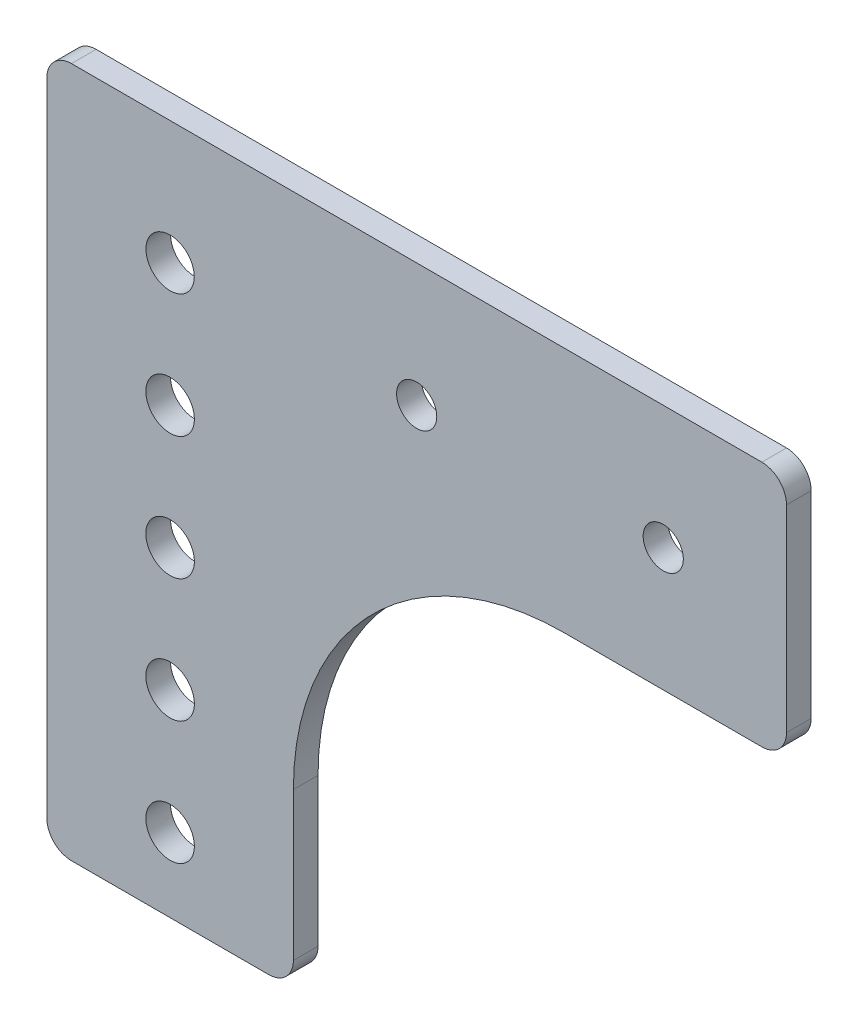
ISO-10303-21;
HEADER;
FILE_DESCRIPTION(('STEP AP214'),'2;1');
FILE_NAME('part.step','',(''),(''),'','','');
FILE_SCHEMA(('AUTOMOTIVE_DESIGN { 1 0 10303 214 1 1 1 1 }'));
ENDSEC;
DATA;
#1=APPLICATION_CONTEXT('core data for automotive mechanical design processes');
#2=APPLICATION_PROTOCOL_DEFINITION('international standard','automotive_design',2000,#1);
#3=PRODUCT_CONTEXT('',#1,'mechanical');
#4=PRODUCT('Part','Part','',(#3));
#5=PRODUCT_RELATED_PRODUCT_CATEGORY('part','',(#4));
#6=PRODUCT_DEFINITION_FORMATION('','',#4);
#7=PRODUCT_DEFINITION_CONTEXT('part definition',#1,'design');
#8=PRODUCT_DEFINITION('design','',#6,#7);
#9=PRODUCT_DEFINITION_SHAPE('','',#8);
#10=(LENGTH_UNIT() NAMED_UNIT(*) SI_UNIT(.MILLI.,.METRE.));
#11=(NAMED_UNIT(*) PLANE_ANGLE_UNIT() SI_UNIT($,.RADIAN.));
#12=(NAMED_UNIT(*) SI_UNIT($,.STERADIAN.) SOLID_ANGLE_UNIT());
#13=UNCERTAINTY_MEASURE_WITH_UNIT(LENGTH_MEASURE(1.E-05),#10,'distance_accuracy_value','');
#14=(GEOMETRIC_REPRESENTATION_CONTEXT(3) GLOBAL_UNCERTAINTY_ASSIGNED_CONTEXT((#13)) GLOBAL_UNIT_ASSIGNED_CONTEXT((#10,
#11,#12)) REPRESENTATION_CONTEXT('',''));
#15=CARTESIAN_POINT('',(0.,0.,0.));
#16=DIRECTION('',(0.,0.,1.));
#17=DIRECTION('',(1.,0.,0.));
#18=AXIS2_PLACEMENT_3D('',#15,#16,#17);
#19=CARTESIAN_POINT('',(14.5399999999993,-27.9400000000002,2.54));
#20=DIRECTION('',(0.,0.,1.));
#21=DIRECTION('',(1.,0.,0.));
#22=AXIS2_PLACEMENT_3D('',#19,#20,#21);
#23=PLANE('',#22);
#24=CARTESIAN_POINT('',(50.0999999999995,-38.1,2.54));
#25=DIRECTION('',(0.,0.,1.));
#26=DIRECTION('',(1.,0.,0.));
#27=AXIS2_PLACEMENT_3D('',#24,#25,#26);
#28=CIRCLE('',#27,2.07009999999997);
#29=CARTESIAN_POINT('',(52.1700999999995,-38.1,2.54));
#30=VERTEX_POINT('',#29);
#31=EDGE_CURVE('E277',#30,#30,#28,.T.);
#32=ORIENTED_EDGE('',*,*,#31,.F.);
#33=EDGE_LOOP('',(#32));
#34=FACE_BOUND('',#33,.T.);
#35=CARTESIAN_POINT('',(24.6999999999996,-50.8000000000002,2.54));
#36=DIRECTION('',(0.,0.,1.));
#37=DIRECTION('',(1.,0.,0.));
#38=AXIS2_PLACEMENT_3D('',#35,#36,#37);
#39=CIRCLE('',#38,2.49999999999967);
#40=CARTESIAN_POINT('',(27.1999999999992,-50.8000000000002,2.54));
#41=VERTEX_POINT('',#40);
#42=EDGE_CURVE('E265',#41,#41,#39,.T.);
#43=ORIENTED_EDGE('',*,*,#42,.F.);
#44=EDGE_LOOP('',(#43));
#45=FACE_BOUND('',#44,.T.);
#46=CARTESIAN_POINT('',(24.6999999999996,-76.2,2.54));
#47=DIRECTION('',(0.,0.,1.));
#48=DIRECTION('',(1.,0.,0.));
#49=AXIS2_PLACEMENT_3D('',#46,#47,#48);
#50=CIRCLE('',#49,2.49999999999978);
#51=CARTESIAN_POINT('',(27.1999999999994,-76.2,2.54));
#52=VERTEX_POINT('',#51);
#53=EDGE_CURVE('E253',#52,#52,#50,.T.);
#54=ORIENTED_EDGE('',*,*,#53,.F.);
#55=EDGE_LOOP('',(#54));
#56=FACE_BOUND('',#55,.T.);
#57=DIRECTION('',(0.,-1.,0.));
#58=VECTOR('',#57,1.);
#59=CARTESIAN_POINT('',(11.9999999999993,-93.9800000000002,2.54));
#60=LINE('',#59,#58);
#61=CARTESIAN_POINT('',(11.9999999999993,-27.9400000000002,2.54));
#62=VERTEX_POINT('',#61);
#63=CARTESIAN_POINT('',(11.9999999999993,-93.9800000000002,2.54));
#64=VERTEX_POINT('',#63);
#65=EDGE_CURVE('E50',#62,#64,#60,.T.);
#66=ORIENTED_EDGE('',*,*,#65,.T.);
#67=CARTESIAN_POINT('',(14.5399999999993,-93.9800000000002,2.54));
#68=DIRECTION('',(0.,0.,1.));
#69=DIRECTION('',(-1.,0.,0.));
#70=AXIS2_PLACEMENT_3D('',#67,#68,#69);
#71=CIRCLE('',#70,2.54);
#72=CARTESIAN_POINT('',(14.5399999999993,-96.5200000000002,2.54));
#73=VERTEX_POINT('',#72);
#74=EDGE_CURVE('E106',#64,#73,#71,.T.);
#75=ORIENTED_EDGE('',*,*,#74,.T.);
#76=DIRECTION('',(1.,0.,0.));
#77=VECTOR('',#76,1.);
#78=CARTESIAN_POINT('',(34.8599999999996,-96.5200000000002,2.54));
#79=LINE('',#78,#77);
#80=CARTESIAN_POINT('',(34.8599999999996,-96.5200000000002,2.54));
#81=VERTEX_POINT('',#80);
#82=EDGE_CURVE('E206',#73,#81,#79,.T.);
#83=ORIENTED_EDGE('',*,*,#82,.T.);
#84=CARTESIAN_POINT('',(34.8599999999996,-93.9800000000002,2.54));
#85=DIRECTION('',(0.,0.,1.));
#86=DIRECTION('',(1.,0.,0.));
#87=AXIS2_PLACEMENT_3D('',#84,#85,#86);
#88=CIRCLE('',#87,2.54);
#89=CARTESIAN_POINT('',(37.3999999999996,-93.9800000000002,2.54));
#90=VERTEX_POINT('',#89);
#91=EDGE_CURVE('E226',#81,#90,#88,.T.);
#92=ORIENTED_EDGE('',*,*,#91,.T.);
#93=DIRECTION('',(0.,1.,0.));
#94=VECTOR('',#93,1.);
#95=CARTESIAN_POINT('',(37.3999999999996,-93.9800000000002,2.54));
#96=LINE('',#95,#94);
#97=CARTESIAN_POINT('',(37.3999999999995,-78.7399999999999,2.54));
#98=VERTEX_POINT('',#97);
#99=EDGE_CURVE('E223',#90,#98,#96,.T.);
#100=ORIENTED_EDGE('',*,*,#99,.T.);
#101=CARTESIAN_POINT('',(65.3399999999996,-78.74,2.54));
#102=DIRECTION('',(0.,0.,-1.));
#103=DIRECTION('',(-1.,0.,0.));
#104=AXIS2_PLACEMENT_3D('',#101,#102,#103);
#105=CIRCLE('',#104,27.94);
#106=CARTESIAN_POINT('',(65.3399999999996,-50.7999999999999,2.54));
#107=VERTEX_POINT('',#106);
#108=EDGE_CURVE('E225',#98,#107,#105,.T.);
#109=ORIENTED_EDGE('',*,*,#108,.T.);
#110=DIRECTION('',(1.,0.,0.));
#111=VECTOR('',#110,1.);
#112=CARTESIAN_POINT('',(85.6599999999993,-50.7999999999999,2.54));
#113=LINE('',#112,#111);
#114=CARTESIAN_POINT('',(85.6599999999993,-50.7999999999999,2.54));
#115=VERTEX_POINT('',#114);
#116=EDGE_CURVE('E228',#107,#115,#113,.T.);
#117=ORIENTED_EDGE('',*,*,#116,.T.);
#118=CARTESIAN_POINT('',(85.6599999999993,-48.2599999999999,2.54));
#119=DIRECTION('',(0.,0.,1.));
#120=DIRECTION('',(1.,0.,0.));
#121=AXIS2_PLACEMENT_3D('',#118,#119,#120);
#122=CIRCLE('',#121,2.53999999999999);
#123=CARTESIAN_POINT('',(88.1999999999993,-48.2599999999999,2.54));
#124=VERTEX_POINT('',#123);
#125=EDGE_CURVE('E234',#115,#124,#122,.T.);
#126=ORIENTED_EDGE('',*,*,#125,.T.);
#127=DIRECTION('',(0.,1.,0.));
#128=VECTOR('',#127,1.);
#129=CARTESIAN_POINT('',(88.1999999999993,-48.2599999999999,2.54));
#130=LINE('',#129,#128);
#131=CARTESIAN_POINT('',(88.1999999999992,-27.9400000000002,2.54));
#132=VERTEX_POINT('',#131);
#133=EDGE_CURVE('E138',#124,#132,#130,.T.);
#134=ORIENTED_EDGE('',*,*,#133,.T.);
#135=CARTESIAN_POINT('',(85.6599999999993,-27.9400000000002,2.54));
#136=DIRECTION('',(0.,0.,1.));
#137=DIRECTION('',(1.,0.,0.));
#138=AXIS2_PLACEMENT_3D('',#135,#136,#137);
#139=CIRCLE('',#138,2.53999999999999);
#140=CARTESIAN_POINT('',(85.6599999999993,-25.4000000000002,2.54));
#141=VERTEX_POINT('',#140);
#142=EDGE_CURVE('E132',#132,#141,#139,.T.);
#143=ORIENTED_EDGE('',*,*,#142,.T.);
#144=DIRECTION('',(-1.,0.,0.));
#145=VECTOR('',#144,1.);
#146=CARTESIAN_POINT('',(85.6599999999993,-25.4000000000002,2.54));
#147=LINE('',#146,#145);
#148=CARTESIAN_POINT('',(14.5399999999993,-25.4000000000002,2.54));
#149=VERTEX_POINT('',#148);
#150=EDGE_CURVE('E136',#141,#149,#147,.T.);
#151=ORIENTED_EDGE('',*,*,#150,.T.);
#152=CARTESIAN_POINT('',(14.5399999999993,-27.9400000000002,2.54));
#153=DIRECTION('',(0.,0.,1.));
#154=DIRECTION('',(1.,0.,0.));
#155=AXIS2_PLACEMENT_3D('',#152,#153,#154);
#156=CIRCLE('',#155,2.54);
#157=EDGE_CURVE('E152',#149,#62,#156,.T.);
#158=ORIENTED_EDGE('',*,*,#157,.T.);
#159=EDGE_LOOP('',(#66,#75,#83,#92,#100,#109,#117,#126,#134,#143,#151,#158));
#160=FACE_BOUND('',#159,.T.);
#161=CARTESIAN_POINT('',(24.6999999999996,-88.9000000000002,2.54));
#162=DIRECTION('',(0.,0.,1.));
#163=DIRECTION('',(1.,0.,0.));
#164=AXIS2_PLACEMENT_3D('',#161,#162,#163);
#165=CIRCLE('',#164,2.49999999999967);
#166=CARTESIAN_POINT('',(27.1999999999992,-88.9000000000002,2.54));
#167=VERTEX_POINT('',#166);
#168=EDGE_CURVE('E161',#167,#167,#165,.T.);
#169=ORIENTED_EDGE('',*,*,#168,.F.);
#170=EDGE_LOOP('',(#169));
#171=FACE_BOUND('',#170,.T.);
#172=CARTESIAN_POINT('',(24.6999999999996,-63.5000000000001,2.54));
#173=DIRECTION('',(0.,0.,1.));
#174=DIRECTION('',(1.,0.,0.));
#175=AXIS2_PLACEMENT_3D('',#172,#173,#174);
#176=CIRCLE('',#175,2.49999999999978);
#177=CARTESIAN_POINT('',(27.1999999999994,-63.5000000000001,2.54));
#178=VERTEX_POINT('',#177);
#179=EDGE_CURVE('E259',#178,#178,#176,.T.);
#180=ORIENTED_EDGE('',*,*,#179,.F.);
#181=EDGE_LOOP('',(#180));
#182=FACE_BOUND('',#181,.T.);
#183=CARTESIAN_POINT('',(24.6999999999996,-38.1,2.54));
#184=DIRECTION('',(0.,0.,1.));
#185=DIRECTION('',(1.,0.,0.));
#186=AXIS2_PLACEMENT_3D('',#183,#184,#185);
#187=CIRCLE('',#186,2.48919999999982);
#188=CARTESIAN_POINT('',(27.1891999999994,-38.1,2.54));
#189=VERTEX_POINT('',#188);
#190=EDGE_CURVE('E271',#189,#189,#187,.T.);
#191=ORIENTED_EDGE('',*,*,#190,.F.);
#192=EDGE_LOOP('',(#191));
#193=FACE_BOUND('',#192,.T.);
#194=CARTESIAN_POINT('',(75.4999999999995,-38.1000000000001,2.54));
#195=DIRECTION('',(0.,0.,1.));
#196=DIRECTION('',(1.,0.,0.));
#197=AXIS2_PLACEMENT_3D('',#194,#195,#196);
#198=CIRCLE('',#197,2.07009999999997);
#199=CARTESIAN_POINT('',(77.5700999999994,-38.1000000000001,2.54));
#200=VERTEX_POINT('',#199);
#201=EDGE_CURVE('E283',#200,#200,#198,.T.);
#202=ORIENTED_EDGE('',*,*,#201,.F.);
#203=EDGE_LOOP('',(#202));
#204=FACE_BOUND('',#203,.T.);
#205=ADVANCED_FACE('F33',(#34,#45,#56,#160,#171,#182,#193,#204),#23,.T.);
#206=CARTESIAN_POINT('',(14.5399999999993,-27.9400000000002,0.));
#207=DIRECTION('',(0.,0.,1.));
#208=DIRECTION('',(1.,0.,0.));
#209=AXIS2_PLACEMENT_3D('',#206,#207,#208);
#210=PLANE('',#209);
#211=CARTESIAN_POINT('',(14.5399999999993,-93.9800000000002,0.));
#212=DIRECTION('',(0.,0.,1.));
#213=DIRECTION('',(-1.,0.,0.));
#214=AXIS2_PLACEMENT_3D('',#211,#212,#213);
#215=CIRCLE('',#214,2.54);
#216=CARTESIAN_POINT('',(11.9999999999993,-93.9800000000002,0.));
#217=VERTEX_POINT('',#216);
#218=CARTESIAN_POINT('',(14.5399999999993,-96.5200000000002,0.));
#219=VERTEX_POINT('',#218);
#220=EDGE_CURVE('E158',#217,#219,#215,.T.);
#221=ORIENTED_EDGE('',*,*,#220,.F.);
#222=DIRECTION('',(0.,-1.,0.));
#223=VECTOR('',#222,1.);
#224=CARTESIAN_POINT('',(11.9999999999993,-50.8000000000002,0.));
#225=LINE('',#224,#223);
#226=CARTESIAN_POINT('',(11.9999999999993,-27.9400000000002,0.));
#227=VERTEX_POINT('',#226);
#228=EDGE_CURVE('E178',#227,#217,#225,.T.);
#229=ORIENTED_EDGE('',*,*,#228,.F.);
#230=CARTESIAN_POINT('',(14.5399999999993,-27.9400000000002,0.));
#231=DIRECTION('',(0.,0.,1.));
#232=DIRECTION('',(1.,0.,0.));
#233=AXIS2_PLACEMENT_3D('',#230,#231,#232);
#234=CIRCLE('',#233,2.54);
#235=CARTESIAN_POINT('',(14.5399999999993,-25.4000000000002,0.));
#236=VERTEX_POINT('',#235);
#237=EDGE_CURVE('E99',#236,#227,#234,.T.);
#238=ORIENTED_EDGE('',*,*,#237,.F.);
#239=DIRECTION('',(-1.,0.,0.));
#240=VECTOR('',#239,1.);
#241=CARTESIAN_POINT('',(85.6599999999993,-25.4000000000002,0.));
#242=LINE('',#241,#240);
#243=CARTESIAN_POINT('',(85.6599999999993,-25.4000000000002,0.));
#244=VERTEX_POINT('',#243);
#245=EDGE_CURVE('E92',#244,#236,#242,.T.);
#246=ORIENTED_EDGE('',*,*,#245,.F.);
#247=CARTESIAN_POINT('',(85.6599999999993,-27.9400000000002,0.));
#248=DIRECTION('',(0.,0.,1.));
#249=DIRECTION('',(1.,0.,0.));
#250=AXIS2_PLACEMENT_3D('',#247,#248,#249);
#251=CIRCLE('',#250,2.53999999999999);
#252=CARTESIAN_POINT('',(88.1999999999992,-27.9400000000002,0.));
#253=VERTEX_POINT('',#252);
#254=EDGE_CURVE('E146',#253,#244,#251,.T.);
#255=ORIENTED_EDGE('',*,*,#254,.F.);
#256=DIRECTION('',(0.,1.,0.));
#257=VECTOR('',#256,1.);
#258=CARTESIAN_POINT('',(88.1999999999993,-48.2599999999999,0.));
#259=LINE('',#258,#257);
#260=CARTESIAN_POINT('',(88.1999999999993,-48.2599999999999,0.));
#261=VERTEX_POINT('',#260);
#262=EDGE_CURVE('E173',#261,#253,#259,.T.);
#263=ORIENTED_EDGE('',*,*,#262,.F.);
#264=CARTESIAN_POINT('',(85.6599999999993,-48.2599999999999,0.));
#265=DIRECTION('',(0.,0.,1.));
#266=DIRECTION('',(1.,0.,0.));
#267=AXIS2_PLACEMENT_3D('',#264,#265,#266);
#268=CIRCLE('',#267,2.53999999999999);
#269=CARTESIAN_POINT('',(85.6599999999993,-50.7999999999999,0.));
#270=VERTEX_POINT('',#269);
#271=EDGE_CURVE('E171',#270,#261,#268,.T.);
#272=ORIENTED_EDGE('',*,*,#271,.F.);
#273=DIRECTION('',(1.,0.,0.));
#274=VECTOR('',#273,1.);
#275=CARTESIAN_POINT('',(85.6599999999993,-50.7999999999999,0.));
#276=LINE('',#275,#274);
#277=CARTESIAN_POINT('',(65.3399999999996,-50.7999999999999,0.));
#278=VERTEX_POINT('',#277);
#279=EDGE_CURVE('E169',#278,#270,#276,.T.);
#280=ORIENTED_EDGE('',*,*,#279,.F.);
#281=CARTESIAN_POINT('',(65.3399999999996,-78.74,0.));
#282=DIRECTION('',(0.,0.,-1.));
#283=DIRECTION('',(-1.,0.,0.));
#284=AXIS2_PLACEMENT_3D('',#281,#282,#283);
#285=CIRCLE('',#284,27.94);
#286=CARTESIAN_POINT('',(37.3999999999995,-78.7399999999999,0.));
#287=VERTEX_POINT('',#286);
#288=EDGE_CURVE('E167',#287,#278,#285,.T.);
#289=ORIENTED_EDGE('',*,*,#288,.F.);
#290=DIRECTION('',(0.,1.,0.));
#291=VECTOR('',#290,1.);
#292=CARTESIAN_POINT('',(37.3999999999996,-93.9800000000002,0.));
#293=LINE('',#292,#291);
#294=CARTESIAN_POINT('',(37.3999999999996,-93.9800000000002,0.));
#295=VERTEX_POINT('',#294);
#296=EDGE_CURVE('E165',#295,#287,#293,.T.);
#297=ORIENTED_EDGE('',*,*,#296,.F.);
#298=CARTESIAN_POINT('',(34.8599999999996,-93.9800000000002,0.));
#299=DIRECTION('',(0.,0.,1.));
#300=DIRECTION('',(1.,0.,0.));
#301=AXIS2_PLACEMENT_3D('',#298,#299,#300);
#302=CIRCLE('',#301,2.54);
#303=CARTESIAN_POINT('',(34.8599999999996,-96.5200000000002,0.));
#304=VERTEX_POINT('',#303);
#305=EDGE_CURVE('E163',#304,#295,#302,.T.);
#306=ORIENTED_EDGE('',*,*,#305,.F.);
#307=DIRECTION('',(1.,0.,0.));
#308=VECTOR('',#307,1.);
#309=CARTESIAN_POINT('',(34.8599999999996,-96.5200000000002,0.));
#310=LINE('',#309,#308);
#311=EDGE_CURVE('E160',#219,#304,#310,.T.);
#312=ORIENTED_EDGE('',*,*,#311,.F.);
#313=EDGE_LOOP('',(#221,#229,#238,#246,#255,#263,#272,#280,#289,#297,#306,#312));
#314=FACE_BOUND('',#313,.T.);
#315=CARTESIAN_POINT('',(24.6999999999996,-88.9000000000002,0.));
#316=DIRECTION('',(0.,0.,1.));
#317=DIRECTION('',(1.,0.,0.));
#318=AXIS2_PLACEMENT_3D('',#315,#316,#317);
#319=CIRCLE('',#318,2.49999999999967);
#320=CARTESIAN_POINT('',(27.1999999999992,-88.9000000000002,0.));
#321=VERTEX_POINT('',#320);
#322=EDGE_CURVE('E250',#321,#321,#319,.T.);
#323=ORIENTED_EDGE('',*,*,#322,.T.);
#324=EDGE_LOOP('',(#323));
#325=FACE_BOUND('',#324,.T.);
#326=CARTESIAN_POINT('',(24.6999999999996,-76.2,0.));
#327=DIRECTION('',(0.,0.,1.));
#328=DIRECTION('',(1.,0.,0.));
#329=AXIS2_PLACEMENT_3D('',#326,#327,#328);
#330=CIRCLE('',#329,2.49999999999978);
#331=CARTESIAN_POINT('',(27.1999999999994,-76.2,0.));
#332=VERTEX_POINT('',#331);
#333=EDGE_CURVE('E256',#332,#332,#330,.T.);
#334=ORIENTED_EDGE('',*,*,#333,.T.);
#335=EDGE_LOOP('',(#334));
#336=FACE_BOUND('',#335,.T.);
#337=CARTESIAN_POINT('',(24.6999999999996,-63.5000000000001,0.));
#338=DIRECTION('',(0.,0.,1.));
#339=DIRECTION('',(1.,0.,0.));
#340=AXIS2_PLACEMENT_3D('',#337,#338,#339);
#341=CIRCLE('',#340,2.49999999999978);
#342=CARTESIAN_POINT('',(27.1999999999994,-63.5000000000001,0.));
#343=VERTEX_POINT('',#342);
#344=EDGE_CURVE('E262',#343,#343,#341,.T.);
#345=ORIENTED_EDGE('',*,*,#344,.T.);
#346=EDGE_LOOP('',(#345));
#347=FACE_BOUND('',#346,.T.);
#348=CARTESIAN_POINT('',(24.6999999999996,-50.8000000000002,0.));
#349=DIRECTION('',(0.,0.,1.));
#350=DIRECTION('',(1.,0.,0.));
#351=AXIS2_PLACEMENT_3D('',#348,#349,#350);
#352=CIRCLE('',#351,2.49999999999967);
#353=CARTESIAN_POINT('',(27.1999999999992,-50.8000000000002,0.));
#354=VERTEX_POINT('',#353);
#355=EDGE_CURVE('E268',#354,#354,#352,.T.);
#356=ORIENTED_EDGE('',*,*,#355,.T.);
#357=EDGE_LOOP('',(#356));
#358=FACE_BOUND('',#357,.T.);
#359=CARTESIAN_POINT('',(24.6999999999996,-38.1,0.));
#360=DIRECTION('',(0.,0.,1.));
#361=DIRECTION('',(1.,0.,0.));
#362=AXIS2_PLACEMENT_3D('',#359,#360,#361);
#363=CIRCLE('',#362,2.48919999999982);
#364=CARTESIAN_POINT('',(27.1891999999994,-38.1,0.));
#365=VERTEX_POINT('',#364);
#366=EDGE_CURVE('E274',#365,#365,#363,.T.);
#367=ORIENTED_EDGE('',*,*,#366,.T.);
#368=EDGE_LOOP('',(#367));
#369=FACE_BOUND('',#368,.T.);
#370=CARTESIAN_POINT('',(50.0999999999995,-38.1,0.));
#371=DIRECTION('',(0.,0.,1.));
#372=DIRECTION('',(1.,0.,0.));
#373=AXIS2_PLACEMENT_3D('',#370,#371,#372);
#374=CIRCLE('',#373,2.07009999999997);
#375=CARTESIAN_POINT('',(52.1700999999995,-38.1,0.));
#376=VERTEX_POINT('',#375);
#377=EDGE_CURVE('E280',#376,#376,#374,.T.);
#378=ORIENTED_EDGE('',*,*,#377,.T.);
#379=EDGE_LOOP('',(#378));
#380=FACE_BOUND('',#379,.T.);
#381=CARTESIAN_POINT('',(75.4999999999995,-38.1000000000001,0.));
#382=DIRECTION('',(0.,0.,1.));
#383=DIRECTION('',(1.,0.,0.));
#384=AXIS2_PLACEMENT_3D('',#381,#382,#383);
#385=CIRCLE('',#384,2.07009999999997);
#386=CARTESIAN_POINT('',(77.5700999999994,-38.1000000000001,0.));
#387=VERTEX_POINT('',#386);
#388=EDGE_CURVE('E286',#387,#387,#385,.T.);
#389=ORIENTED_EDGE('',*,*,#388,.T.);
#390=EDGE_LOOP('',(#389));
#391=FACE_BOUND('',#390,.T.);
#392=ADVANCED_FACE('F210',(#314,#325,#336,#347,#358,#369,#380,#391),#210,.F.);
#393=CARTESIAN_POINT('',(14.5399999999993,-93.9800000000002,2.54));
#394=DIRECTION('',(0.,0.,-1.));
#395=DIRECTION('',(-1.,0.,0.));
#396=AXIS2_PLACEMENT_3D('',#393,#394,#395);
#397=CYLINDRICAL_SURFACE('',#396,2.54);
#398=ORIENTED_EDGE('',*,*,#220,.T.);
#399=DIRECTION('',(0.,0.,-1.));
#400=VECTOR('',#399,1.);
#401=CARTESIAN_POINT('',(14.5399999999993,-96.5200000000002,2.54));
#402=LINE('',#401,#400);
#403=EDGE_CURVE('E42',#73,#219,#402,.T.);
#404=ORIENTED_EDGE('',*,*,#403,.F.);
#405=ORIENTED_EDGE('',*,*,#74,.F.);
#406=DIRECTION('',(0.,0.,-1.));
#407=VECTOR('',#406,1.);
#408=CARTESIAN_POINT('',(11.9999999999993,-93.9800000000002,2.54));
#409=LINE('',#408,#407);
#410=EDGE_CURVE('E11',#64,#217,#409,.T.);
#411=ORIENTED_EDGE('',*,*,#410,.T.);
#412=EDGE_LOOP('',(#398,#404,#405,#411));
#413=FACE_BOUND('',#412,.T.);
#414=ADVANCED_FACE('F35',(#413),#397,.T.);
#415=CARTESIAN_POINT('',(34.8599999999996,-96.5200000000002,2.54));
#416=DIRECTION('',(0.,1.,0.));
#417=DIRECTION('',(0.,0.,1.));
#418=AXIS2_PLACEMENT_3D('',#415,#416,#417);
#419=PLANE('',#418);
#420=ORIENTED_EDGE('',*,*,#311,.T.);
#421=DIRECTION('',(0.,0.,-1.));
#422=VECTOR('',#421,1.);
#423=CARTESIAN_POINT('',(34.8599999999996,-96.5200000000002,2.54));
#424=LINE('',#423,#422);
#425=EDGE_CURVE('E198',#81,#304,#424,.T.);
#426=ORIENTED_EDGE('',*,*,#425,.F.);
#427=ORIENTED_EDGE('',*,*,#82,.F.);
#428=ORIENTED_EDGE('',*,*,#403,.T.);
#429=EDGE_LOOP('',(#420,#426,#427,#428));
#430=FACE_BOUND('',#429,.T.);
#431=ADVANCED_FACE('F204',(#430),#419,.F.);
#432=CARTESIAN_POINT('',(34.8599999999996,-93.9800000000002,2.54));
#433=DIRECTION('',(0.,0.,-1.));
#434=DIRECTION('',(-1.,0.,0.));
#435=AXIS2_PLACEMENT_3D('',#432,#433,#434);
#436=CYLINDRICAL_SURFACE('',#435,2.54);
#437=ORIENTED_EDGE('',*,*,#305,.T.);
#438=DIRECTION('',(0.,0.,-1.));
#439=VECTOR('',#438,1.);
#440=CARTESIAN_POINT('',(37.3999999999996,-93.9800000000002,2.54));
#441=LINE('',#440,#439);
#442=EDGE_CURVE('E195',#90,#295,#441,.T.);
#443=ORIENTED_EDGE('',*,*,#442,.F.);
#444=ORIENTED_EDGE('',*,*,#91,.F.);
#445=ORIENTED_EDGE('',*,*,#425,.T.);
#446=EDGE_LOOP('',(#437,#443,#444,#445));
#447=FACE_BOUND('',#446,.T.);
#448=ADVANCED_FACE('F217',(#447),#436,.T.);
#449=CARTESIAN_POINT('',(37.3999999999996,-93.9800000000002,2.54));
#450=DIRECTION('',(-1.,0.,0.));
#451=DIRECTION('',(0.,-1.,0.));
#452=AXIS2_PLACEMENT_3D('',#449,#450,#451);
#453=PLANE('',#452);
#454=ORIENTED_EDGE('',*,*,#296,.T.);
#455=DIRECTION('',(0.,0.,-1.));
#456=VECTOR('',#455,1.);
#457=CARTESIAN_POINT('',(37.3999999999995,-78.7399999999999,2.54));
#458=LINE('',#457,#456);
#459=EDGE_CURVE('E192',#98,#287,#458,.T.);
#460=ORIENTED_EDGE('',*,*,#459,.F.);
#461=ORIENTED_EDGE('',*,*,#99,.F.);
#462=ORIENTED_EDGE('',*,*,#442,.T.);
#463=EDGE_LOOP('',(#454,#460,#461,#462));
#464=FACE_BOUND('',#463,.T.);
#465=ADVANCED_FACE('F221',(#464),#453,.F.);
#466=CARTESIAN_POINT('',(65.3399999999996,-78.74,2.54));
#467=DIRECTION('',(0.,0.,-1.));
#468=DIRECTION('',(-1.,0.,0.));
#469=AXIS2_PLACEMENT_3D('',#466,#467,#468);
#470=CYLINDRICAL_SURFACE('',#469,27.94);
#471=ORIENTED_EDGE('',*,*,#288,.T.);
#472=DIRECTION('',(0.,0.,-1.));
#473=VECTOR('',#472,1.);
#474=CARTESIAN_POINT('',(65.3399999999996,-50.7999999999999,2.54));
#475=LINE('',#474,#473);
#476=EDGE_CURVE('E189',#107,#278,#475,.T.);
#477=ORIENTED_EDGE('',*,*,#476,.F.);
#478=ORIENTED_EDGE('',*,*,#108,.F.);
#479=ORIENTED_EDGE('',*,*,#459,.T.);
#480=EDGE_LOOP('',(#471,#477,#478,#479));
#481=FACE_BOUND('',#480,.T.);
#482=ADVANCED_FACE('F323',(#481),#470,.F.);
#483=CARTESIAN_POINT('',(85.6599999999993,-50.7999999999999,2.54));
#484=DIRECTION('',(0.,1.,0.));
#485=DIRECTION('',(-1.,0.,0.));
#486=AXIS2_PLACEMENT_3D('',#483,#484,#485);
#487=PLANE('',#486);
#488=ORIENTED_EDGE('',*,*,#279,.T.);
#489=DIRECTION('',(0.,0.,-1.));
#490=VECTOR('',#489,1.);
#491=CARTESIAN_POINT('',(85.6599999999993,-50.7999999999999,2.54));
#492=LINE('',#491,#490);
#493=EDGE_CURVE('E186',#115,#270,#492,.T.);
#494=ORIENTED_EDGE('',*,*,#493,.F.);
#495=ORIENTED_EDGE('',*,*,#116,.F.);
#496=ORIENTED_EDGE('',*,*,#476,.T.);
#497=EDGE_LOOP('',(#488,#494,#495,#496));
#498=FACE_BOUND('',#497,.T.);
#499=ADVANCED_FACE('F320',(#498),#487,.F.);
#500=CARTESIAN_POINT('',(85.6599999999993,-48.2599999999999,2.54));
#501=DIRECTION('',(0.,0.,-1.));
#502=DIRECTION('',(-1.,0.,0.));
#503=AXIS2_PLACEMENT_3D('',#500,#501,#502);
#504=CYLINDRICAL_SURFACE('',#503,2.53999999999999);
#505=ORIENTED_EDGE('',*,*,#271,.T.);
#506=DIRECTION('',(0.,0.,-1.));
#507=VECTOR('',#506,1.);
#508=CARTESIAN_POINT('',(88.1999999999993,-48.2599999999999,2.54));
#509=LINE('',#508,#507);
#510=EDGE_CURVE('E183',#124,#261,#509,.T.);
#511=ORIENTED_EDGE('',*,*,#510,.F.);
#512=ORIENTED_EDGE('',*,*,#125,.F.);
#513=ORIENTED_EDGE('',*,*,#493,.T.);
#514=EDGE_LOOP('',(#505,#511,#512,#513));
#515=FACE_BOUND('',#514,.T.);
#516=ADVANCED_FACE('F240',(#515),#504,.T.);
#517=CARTESIAN_POINT('',(88.1999999999993,-48.2599999999999,2.54));
#518=DIRECTION('',(-1.,0.,0.));
#519=DIRECTION('',(0.,-1.,0.));
#520=AXIS2_PLACEMENT_3D('',#517,#518,#519);
#521=PLANE('',#520);
#522=ORIENTED_EDGE('',*,*,#262,.T.);
#523=DIRECTION('',(0.,0.,-1.));
#524=VECTOR('',#523,1.);
#525=CARTESIAN_POINT('',(88.1999999999992,-27.9400000000002,2.54));
#526=LINE('',#525,#524);
#527=EDGE_CURVE('E147',#132,#253,#526,.T.);
#528=ORIENTED_EDGE('',*,*,#527,.F.);
#529=ORIENTED_EDGE('',*,*,#133,.F.);
#530=ORIENTED_EDGE('',*,*,#510,.T.);
#531=EDGE_LOOP('',(#522,#528,#529,#530));
#532=FACE_BOUND('',#531,.T.);
#533=ADVANCED_FACE('F244',(#532),#521,.F.);
#534=CARTESIAN_POINT('',(85.6599999999993,-27.9400000000002,2.54));
#535=DIRECTION('',(0.,0.,-1.));
#536=DIRECTION('',(-1.,0.,0.));
#537=AXIS2_PLACEMENT_3D('',#534,#535,#536);
#538=CYLINDRICAL_SURFACE('',#537,2.53999999999999);
#539=ORIENTED_EDGE('',*,*,#254,.T.);
#540=DIRECTION('',(0.,0.,-1.));
#541=VECTOR('',#540,1.);
#542=CARTESIAN_POINT('',(85.6599999999993,-25.4000000000002,2.54));
#543=LINE('',#542,#541);
#544=EDGE_CURVE('E143',#141,#244,#543,.T.);
#545=ORIENTED_EDGE('',*,*,#544,.F.);
#546=ORIENTED_EDGE('',*,*,#142,.F.);
#547=ORIENTED_EDGE('',*,*,#527,.T.);
#548=EDGE_LOOP('',(#539,#545,#546,#547));
#549=FACE_BOUND('',#548,.T.);
#550=ADVANCED_FACE('F144',(#549),#538,.T.);
#551=CARTESIAN_POINT('',(85.6599999999993,-25.4000000000002,2.54));
#552=DIRECTION('',(0.,-1.,0.));
#553=DIRECTION('',(1.,0.,0.));
#554=AXIS2_PLACEMENT_3D('',#551,#552,#553);
#555=PLANE('',#554);
#556=ORIENTED_EDGE('',*,*,#245,.T.);
#557=DIRECTION('',(0.,0.,-1.));
#558=VECTOR('',#557,1.);
#559=CARTESIAN_POINT('',(14.5399999999993,-25.4000000000002,2.54));
#560=LINE('',#559,#558);
#561=EDGE_CURVE('E148',#149,#236,#560,.T.);
#562=ORIENTED_EDGE('',*,*,#561,.F.);
#563=ORIENTED_EDGE('',*,*,#150,.F.);
#564=ORIENTED_EDGE('',*,*,#544,.T.);
#565=EDGE_LOOP('',(#556,#562,#563,#564));
#566=FACE_BOUND('',#565,.T.);
#567=ADVANCED_FACE('F150',(#566),#555,.F.);
#568=CARTESIAN_POINT('',(14.5399999999993,-27.9400000000002,2.54));
#569=DIRECTION('',(0.,0.,-1.));
#570=DIRECTION('',(-1.,0.,0.));
#571=AXIS2_PLACEMENT_3D('',#568,#569,#570);
#572=CYLINDRICAL_SURFACE('',#571,2.54);
#573=ORIENTED_EDGE('',*,*,#237,.T.);
#574=DIRECTION('',(0.,0.,-1.));
#575=VECTOR('',#574,1.);
#576=CARTESIAN_POINT('',(11.9999999999993,-27.9400000000002,2.54));
#577=LINE('',#576,#575);
#578=EDGE_CURVE('E154',#62,#227,#577,.T.);
#579=ORIENTED_EDGE('',*,*,#578,.F.);
#580=ORIENTED_EDGE('',*,*,#157,.F.);
#581=ORIENTED_EDGE('',*,*,#561,.T.);
#582=EDGE_LOOP('',(#573,#579,#580,#581));
#583=FACE_BOUND('',#582,.T.);
#584=ADVANCED_FACE('F246',(#583),#572,.T.);
#585=CARTESIAN_POINT('',(11.9999999999993,-50.8000000000002,2.54));
#586=DIRECTION('',(1.,0.,0.));
#587=DIRECTION('',(0.,0.,-1.));
#588=AXIS2_PLACEMENT_3D('',#585,#586,#587);
#589=PLANE('',#588);
#590=ORIENTED_EDGE('',*,*,#228,.T.);
#591=ORIENTED_EDGE('',*,*,#410,.F.);
#592=ORIENTED_EDGE('',*,*,#65,.F.);
#593=ORIENTED_EDGE('',*,*,#578,.T.);
#594=EDGE_LOOP('',(#590,#591,#592,#593));
#595=FACE_BOUND('',#594,.T.);
#596=ADVANCED_FACE('F245',(#595),#589,.F.);
#597=CARTESIAN_POINT('',(24.6999999999996,-88.9000000000002,2.54));
#598=DIRECTION('',(0.,0.,-1.));
#599=DIRECTION('',(-1.,0.,0.));
#600=AXIS2_PLACEMENT_3D('',#597,#598,#599);
#601=CYLINDRICAL_SURFACE('',#600,2.49999999999967);
#602=ORIENTED_EDGE('',*,*,#168,.T.);
#603=EDGE_LOOP('',(#602));
#604=FACE_BOUND('',#603,.T.);
#605=ORIENTED_EDGE('',*,*,#322,.F.);
#606=EDGE_LOOP('',(#605));
#607=FACE_BOUND('',#606,.T.);
#608=ADVANCED_FACE('F305',(#604,#607),#601,.F.);
#609=CARTESIAN_POINT('',(24.6999999999996,-76.2,2.54));
#610=DIRECTION('',(0.,0.,-1.));
#611=DIRECTION('',(-1.,0.,0.));
#612=AXIS2_PLACEMENT_3D('',#609,#610,#611);
#613=CYLINDRICAL_SURFACE('',#612,2.49999999999978);
#614=ORIENTED_EDGE('',*,*,#53,.T.);
#615=EDGE_LOOP('',(#614));
#616=FACE_BOUND('',#615,.T.);
#617=ORIENTED_EDGE('',*,*,#333,.F.);
#618=EDGE_LOOP('',(#617));
#619=FACE_BOUND('',#618,.T.);
#620=ADVANCED_FACE('F414',(#616,#619),#613,.F.);
#621=CARTESIAN_POINT('',(24.6999999999996,-63.5000000000001,2.54));
#622=DIRECTION('',(0.,0.,-1.));
#623=DIRECTION('',(-1.,0.,0.));
#624=AXIS2_PLACEMENT_3D('',#621,#622,#623);
#625=CYLINDRICAL_SURFACE('',#624,2.49999999999978);
#626=ORIENTED_EDGE('',*,*,#179,.T.);
#627=EDGE_LOOP('',(#626));
#628=FACE_BOUND('',#627,.T.);
#629=ORIENTED_EDGE('',*,*,#344,.F.);
#630=EDGE_LOOP('',(#629));
#631=FACE_BOUND('',#630,.T.);
#632=ADVANCED_FACE('F422',(#628,#631),#625,.F.);
#633=CARTESIAN_POINT('',(24.6999999999996,-50.8000000000002,2.54));
#634=DIRECTION('',(0.,0.,-1.));
#635=DIRECTION('',(-1.,0.,0.));
#636=AXIS2_PLACEMENT_3D('',#633,#634,#635);
#637=CYLINDRICAL_SURFACE('',#636,2.49999999999967);
#638=ORIENTED_EDGE('',*,*,#42,.T.);
#639=EDGE_LOOP('',(#638));
#640=FACE_BOUND('',#639,.T.);
#641=ORIENTED_EDGE('',*,*,#355,.F.);
#642=EDGE_LOOP('',(#641));
#643=FACE_BOUND('',#642,.T.);
#644=ADVANCED_FACE('F430',(#640,#643),#637,.F.);
#645=CARTESIAN_POINT('',(24.6999999999996,-38.1,2.54));
#646=DIRECTION('',(0.,0.,-1.));
#647=DIRECTION('',(-1.,0.,0.));
#648=AXIS2_PLACEMENT_3D('',#645,#646,#647);
#649=CYLINDRICAL_SURFACE('',#648,2.48919999999982);
#650=ORIENTED_EDGE('',*,*,#190,.T.);
#651=EDGE_LOOP('',(#650));
#652=FACE_BOUND('',#651,.T.);
#653=ORIENTED_EDGE('',*,*,#366,.F.);
#654=EDGE_LOOP('',(#653));
#655=FACE_BOUND('',#654,.T.);
#656=ADVANCED_FACE('F439',(#652,#655),#649,.F.);
#657=CARTESIAN_POINT('',(50.0999999999995,-38.1,2.54));
#658=DIRECTION('',(0.,0.,-1.));
#659=DIRECTION('',(-1.,0.,0.));
#660=AXIS2_PLACEMENT_3D('',#657,#658,#659);
#661=CYLINDRICAL_SURFACE('',#660,2.07009999999997);
#662=ORIENTED_EDGE('',*,*,#31,.T.);
#663=EDGE_LOOP('',(#662));
#664=FACE_BOUND('',#663,.T.);
#665=ORIENTED_EDGE('',*,*,#377,.F.);
#666=EDGE_LOOP('',(#665));
#667=FACE_BOUND('',#666,.T.);
#668=ADVANCED_FACE('F448',(#664,#667),#661,.F.);
#669=CARTESIAN_POINT('',(75.4999999999995,-38.1000000000001,2.54));
#670=DIRECTION('',(0.,0.,-1.));
#671=DIRECTION('',(-1.,0.,0.));
#672=AXIS2_PLACEMENT_3D('',#669,#670,#671);
#673=CYLINDRICAL_SURFACE('',#672,2.07009999999997);
#674=ORIENTED_EDGE('',*,*,#201,.T.);
#675=EDGE_LOOP('',(#674));
#676=FACE_BOUND('',#675,.T.);
#677=ORIENTED_EDGE('',*,*,#388,.F.);
#678=EDGE_LOOP('',(#677));
#679=FACE_BOUND('',#678,.T.);
#680=ADVANCED_FACE('F292',(#676,#679),#673,.F.);
#681=CLOSED_SHELL('',(#205,#392,#414,#431,#448,#465,#482,#499,#516,#533,#550,#567,#584,#596,
#608,#620,#632,#644,#656,#668,#680));
#682=MANIFOLD_SOLID_BREP('B2',#681);
#683=ADVANCED_BREP_SHAPE_REPRESENTATION('',(#18,#682),#14);
#684=SHAPE_DEFINITION_REPRESENTATION(#9,#683);
ENDSEC;
END-ISO-10303-21;
